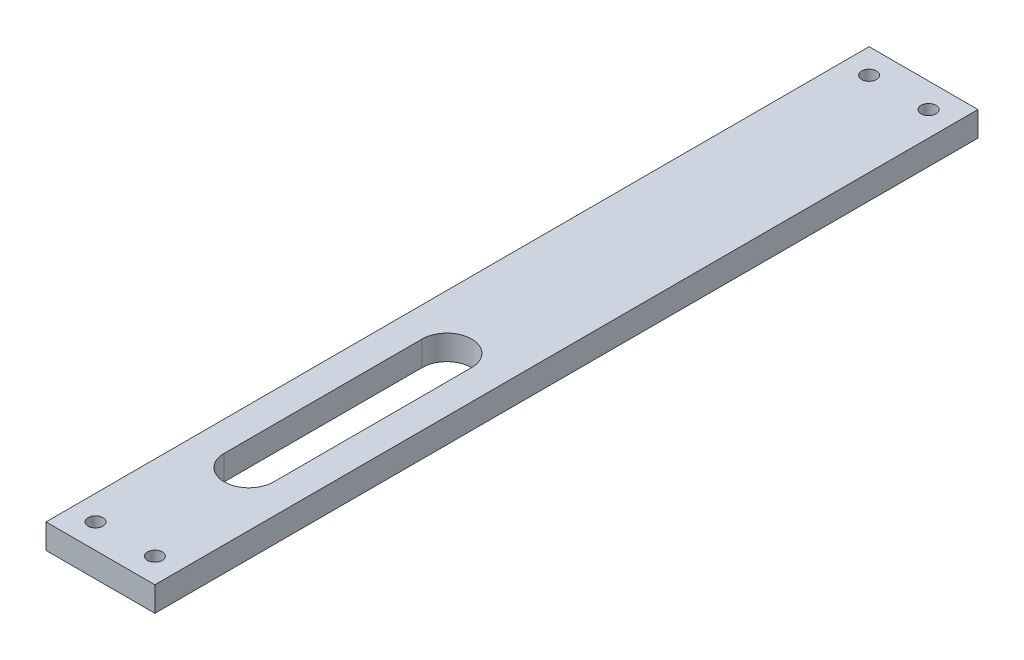
ISO-10303-21;
HEADER;
FILE_DESCRIPTION(('STEP AP214'),'2;1');
FILE_NAME('part.step','',(''),(''),'','','');
FILE_SCHEMA(('AUTOMOTIVE_DESIGN { 1 0 10303 214 1 1 1 1 }'));
ENDSEC;
DATA;
#1=APPLICATION_CONTEXT('core data for automotive mechanical design processes');
#2=APPLICATION_PROTOCOL_DEFINITION('international standard','automotive_design',2000,#1);
#3=PRODUCT_CONTEXT('',#1,'mechanical');
#4=PRODUCT('Part','Part','',(#3));
#5=PRODUCT_RELATED_PRODUCT_CATEGORY('part','',(#4));
#6=PRODUCT_DEFINITION_FORMATION('','',#4);
#7=PRODUCT_DEFINITION_CONTEXT('part definition',#1,'design');
#8=PRODUCT_DEFINITION('design','',#6,#7);
#9=PRODUCT_DEFINITION_SHAPE('','',#8);
#10=(LENGTH_UNIT() NAMED_UNIT(*) SI_UNIT(.MILLI.,.METRE.));
#11=(NAMED_UNIT(*) PLANE_ANGLE_UNIT() SI_UNIT($,.RADIAN.));
#12=(NAMED_UNIT(*) SI_UNIT($,.STERADIAN.) SOLID_ANGLE_UNIT());
#13=UNCERTAINTY_MEASURE_WITH_UNIT(LENGTH_MEASURE(1.E-05),#10,'distance_accuracy_value','');
#14=(GEOMETRIC_REPRESENTATION_CONTEXT(3) GLOBAL_UNCERTAINTY_ASSIGNED_CONTEXT((#13)) GLOBAL_UNIT_ASSIGNED_CONTEXT((#10,
#11,#12)) REPRESENTATION_CONTEXT('',''));
#15=CARTESIAN_POINT('',(0.,0.,0.));
#16=DIRECTION('',(0.,0.,1.));
#17=DIRECTION('',(1.,0.,0.));
#18=AXIS2_PLACEMENT_3D('',#15,#16,#17);
#19=CARTESIAN_POINT('',(22.,5.,0.));
#20=DIRECTION('',(-1.,0.,0.));
#21=DIRECTION('',(0.,0.,1.));
#22=AXIS2_PLACEMENT_3D('',#19,#20,#21);
#23=PLANE('',#22);
#24=DIRECTION('',(0.,0.,-1.));
#25=VECTOR('',#24,1.);
#26=CARTESIAN_POINT('',(22.,0.,0.));
#27=LINE('',#26,#25);
#28=CARTESIAN_POINT('',(22.,0.,0.));
#29=VERTEX_POINT('',#28);
#30=CARTESIAN_POINT('',(22.,0.,-166.3));
#31=VERTEX_POINT('',#30);
#32=EDGE_CURVE('E163',#29,#31,#27,.T.);
#33=ORIENTED_EDGE('',*,*,#32,.T.);
#34=DIRECTION('',(0.,-1.,0.));
#35=VECTOR('',#34,1.);
#36=CARTESIAN_POINT('',(22.,5.,-166.3));
#37=LINE('',#36,#35);
#38=CARTESIAN_POINT('',(22.,5.,-166.3));
#39=VERTEX_POINT('',#38);
#40=EDGE_CURVE('E11',#39,#31,#37,.T.);
#41=ORIENTED_EDGE('',*,*,#40,.F.);
#42=DIRECTION('',(0.,0.,-1.));
#43=VECTOR('',#42,1.);
#44=CARTESIAN_POINT('',(22.,5.,0.));
#45=LINE('',#44,#43);
#46=CARTESIAN_POINT('',(22.,5.,0.));
#47=VERTEX_POINT('',#46);
#48=EDGE_CURVE('E141',#47,#39,#45,.T.);
#49=ORIENTED_EDGE('',*,*,#48,.F.);
#50=DIRECTION('',(0.,-1.,0.));
#51=VECTOR('',#50,1.);
#52=CARTESIAN_POINT('',(22.,5.,0.));
#53=LINE('',#52,#51);
#54=EDGE_CURVE('E157',#47,#29,#53,.T.);
#55=ORIENTED_EDGE('',*,*,#54,.T.);
#56=EDGE_LOOP('',(#33,#41,#49,#55));
#57=FACE_BOUND('',#56,.T.);
#58=ADVANCED_FACE('F34',(#57),#23,.F.);
#59=CARTESIAN_POINT('',(0.,5.,-166.3));
#60=DIRECTION('',(0.,0.,-1.));
#61=DIRECTION('',(-1.,0.,0.));
#62=AXIS2_PLACEMENT_3D('',#59,#60,#61);
#63=PLANE('',#62);
#64=DIRECTION('',(1.,0.,0.));
#65=VECTOR('',#64,1.);
#66=CARTESIAN_POINT('',(0.,0.,-166.3));
#67=LINE('',#66,#65);
#68=CARTESIAN_POINT('',(0.,0.,-166.3));
#69=VERTEX_POINT('',#68);
#70=EDGE_CURVE('E166',#69,#31,#67,.T.);
#71=ORIENTED_EDGE('',*,*,#70,.F.);
#72=DIRECTION('',(0.,-1.,0.));
#73=VECTOR('',#72,1.);
#74=CARTESIAN_POINT('',(0.,5.,-166.3));
#75=LINE('',#74,#73);
#76=CARTESIAN_POINT('',(0.,5.,-166.3));
#77=VERTEX_POINT('',#76);
#78=EDGE_CURVE('E42',#77,#69,#75,.T.);
#79=ORIENTED_EDGE('',*,*,#78,.F.);
#80=DIRECTION('',(1.,0.,0.));
#81=VECTOR('',#80,1.);
#82=CARTESIAN_POINT('',(0.,5.,-166.3));
#83=LINE('',#82,#81);
#84=EDGE_CURVE('E143',#77,#39,#83,.T.);
#85=ORIENTED_EDGE('',*,*,#84,.T.);
#86=ORIENTED_EDGE('',*,*,#40,.T.);
#87=EDGE_LOOP('',(#71,#79,#85,#86));
#88=FACE_BOUND('',#87,.T.);
#89=ADVANCED_FACE('F189',(#88),#63,.T.);
#90=CARTESIAN_POINT('',(0.,5.,0.));
#91=DIRECTION('',(-1.,0.,0.));
#92=DIRECTION('',(0.,0.,1.));
#93=AXIS2_PLACEMENT_3D('',#90,#91,#92);
#94=PLANE('',#93);
#95=DIRECTION('',(0.,0.,-1.));
#96=VECTOR('',#95,1.);
#97=CARTESIAN_POINT('',(0.,0.,0.));
#98=LINE('',#97,#96);
#99=CARTESIAN_POINT('',(0.,0.,0.));
#100=VERTEX_POINT('',#99);
#101=EDGE_CURVE('E169',#100,#69,#98,.T.);
#102=ORIENTED_EDGE('',*,*,#101,.F.);
#103=DIRECTION('',(0.,-1.,0.));
#104=VECTOR('',#103,1.);
#105=CARTESIAN_POINT('',(0.,5.,0.));
#106=LINE('',#105,#104);
#107=CARTESIAN_POINT('',(0.,5.,0.));
#108=VERTEX_POINT('',#107);
#109=EDGE_CURVE('E181',#108,#100,#106,.T.);
#110=ORIENTED_EDGE('',*,*,#109,.F.);
#111=DIRECTION('',(0.,0.,-1.));
#112=VECTOR('',#111,1.);
#113=CARTESIAN_POINT('',(0.,5.,0.));
#114=LINE('',#113,#112);
#115=EDGE_CURVE('E146',#108,#77,#114,.T.);
#116=ORIENTED_EDGE('',*,*,#115,.T.);
#117=ORIENTED_EDGE('',*,*,#78,.T.);
#118=EDGE_LOOP('',(#102,#110,#116,#117));
#119=FACE_BOUND('',#118,.T.);
#120=ADVANCED_FACE('F185',(#119),#94,.T.);
#121=CARTESIAN_POINT('',(17.,5.,-5.));
#122=DIRECTION('',(0.,-1.,0.));
#123=DIRECTION('',(0.,0.,-1.));
#124=AXIS2_PLACEMENT_3D('',#121,#122,#123);
#125=CYLINDRICAL_SURFACE('',#124,1.5);
#126=CARTESIAN_POINT('',(17.,5.,-5.));
#127=DIRECTION('',(0.,1.,0.));
#128=DIRECTION('',(0.,0.,1.));
#129=AXIS2_PLACEMENT_3D('',#126,#127,#128);
#130=CIRCLE('',#129,1.5);
#131=CARTESIAN_POINT('',(17.,5.,-3.5));
#132=VERTEX_POINT('',#131);
#133=EDGE_CURVE('E151',#132,#132,#130,.F.);
#134=ORIENTED_EDGE('',*,*,#133,.F.);
#135=EDGE_LOOP('',(#134));
#136=FACE_BOUND('',#135,.T.);
#137=CARTESIAN_POINT('',(17.,0.,-5.));
#138=DIRECTION('',(0.,1.,0.));
#139=DIRECTION('',(0.,0.,1.));
#140=AXIS2_PLACEMENT_3D('',#137,#138,#139);
#141=CIRCLE('',#140,1.5);
#142=CARTESIAN_POINT('',(17.,0.,-3.5));
#143=VERTEX_POINT('',#142);
#144=EDGE_CURVE('E174',#143,#143,#141,.F.);
#145=ORIENTED_EDGE('',*,*,#144,.T.);
#146=EDGE_LOOP('',(#145));
#147=FACE_BOUND('',#146,.T.);
#148=ADVANCED_FACE('F241',(#136,#147),#125,.F.);
#149=CARTESIAN_POINT('',(0.,5.,0.));
#150=DIRECTION('',(0.,0.,-1.));
#151=DIRECTION('',(-1.,0.,0.));
#152=AXIS2_PLACEMENT_3D('',#149,#150,#151);
#153=PLANE('',#152);
#154=DIRECTION('',(1.,0.,0.));
#155=VECTOR('',#154,1.);
#156=CARTESIAN_POINT('',(0.,0.,0.));
#157=LINE('',#156,#155);
#158=EDGE_CURVE('E172',#100,#29,#157,.T.);
#159=ORIENTED_EDGE('',*,*,#158,.T.);
#160=ORIENTED_EDGE('',*,*,#54,.F.);
#161=DIRECTION('',(1.,0.,0.));
#162=VECTOR('',#161,1.);
#163=CARTESIAN_POINT('',(0.,5.,0.));
#164=LINE('',#163,#162);
#165=EDGE_CURVE('E149',#108,#47,#164,.T.);
#166=ORIENTED_EDGE('',*,*,#165,.F.);
#167=ORIENTED_EDGE('',*,*,#109,.T.);
#168=EDGE_LOOP('',(#159,#160,#166,#167));
#169=FACE_BOUND('',#168,.T.);
#170=ADVANCED_FACE('F198',(#169),#153,.F.);
#171=CARTESIAN_POINT('',(5.,5.,-161.3));
#172=DIRECTION('',(0.,-1.,0.));
#173=DIRECTION('',(0.,0.,-1.));
#174=AXIS2_PLACEMENT_3D('',#171,#172,#173);
#175=CYLINDRICAL_SURFACE('',#174,1.5);
#176=CARTESIAN_POINT('',(5.,5.,-161.3));
#177=DIRECTION('',(0.,1.,0.));
#178=DIRECTION('',(0.,0.,1.));
#179=AXIS2_PLACEMENT_3D('',#176,#177,#178);
#180=CIRCLE('',#179,1.5);
#181=CARTESIAN_POINT('',(5.,5.,-159.8));
#182=VERTEX_POINT('',#181);
#183=EDGE_CURVE('E137',#182,#182,#180,.T.);
#184=ORIENTED_EDGE('',*,*,#183,.T.);
#185=EDGE_LOOP('',(#184));
#186=FACE_BOUND('',#185,.T.);
#187=CARTESIAN_POINT('',(5.,0.,-161.3));
#188=DIRECTION('',(0.,1.,0.));
#189=DIRECTION('',(0.,0.,1.));
#190=AXIS2_PLACEMENT_3D('',#187,#188,#189);
#191=CIRCLE('',#190,1.5);
#192=CARTESIAN_POINT('',(5.,0.,-159.8));
#193=VERTEX_POINT('',#192);
#194=EDGE_CURVE('E160',#193,#193,#191,.T.);
#195=ORIENTED_EDGE('',*,*,#194,.F.);
#196=EDGE_LOOP('',(#195));
#197=FACE_BOUND('',#196,.T.);
#198=ADVANCED_FACE('F233',(#186,#197),#175,.F.);
#199=CARTESIAN_POINT('',(17.,5.,-161.3));
#200=DIRECTION('',(0.,-1.,0.));
#201=DIRECTION('',(0.,0.,-1.));
#202=AXIS2_PLACEMENT_3D('',#199,#200,#201);
#203=CYLINDRICAL_SURFACE('',#202,1.5);
#204=CARTESIAN_POINT('',(17.,5.,-161.3));
#205=DIRECTION('',(0.,1.,0.));
#206=DIRECTION('',(0.,0.,1.));
#207=AXIS2_PLACEMENT_3D('',#204,#205,#206);
#208=CIRCLE('',#207,1.5);
#209=CARTESIAN_POINT('',(17.,5.,-159.8));
#210=VERTEX_POINT('',#209);
#211=EDGE_CURVE('E134',#210,#210,#208,.T.);
#212=ORIENTED_EDGE('',*,*,#211,.T.);
#213=EDGE_LOOP('',(#212));
#214=FACE_BOUND('',#213,.T.);
#215=CARTESIAN_POINT('',(17.,0.,-161.3));
#216=DIRECTION('',(0.,1.,0.));
#217=DIRECTION('',(0.,0.,1.));
#218=AXIS2_PLACEMENT_3D('',#215,#216,#217);
#219=CIRCLE('',#218,1.5);
#220=CARTESIAN_POINT('',(17.,0.,-159.8));
#221=VERTEX_POINT('',#220);
#222=EDGE_CURVE('E130',#221,#221,#219,.T.);
#223=ORIENTED_EDGE('',*,*,#222,.F.);
#224=EDGE_LOOP('',(#223));
#225=FACE_BOUND('',#224,.T.);
#226=ADVANCED_FACE('F36',(#214,#225),#203,.F.);
#227=CARTESIAN_POINT('',(5.,5.,-5.));
#228=DIRECTION('',(0.,-1.,0.));
#229=DIRECTION('',(0.,0.,-1.));
#230=AXIS2_PLACEMENT_3D('',#227,#228,#229);
#231=CYLINDRICAL_SURFACE('',#230,1.5);
#232=CARTESIAN_POINT('',(5.,5.,-5.));
#233=DIRECTION('',(0.,1.,0.));
#234=DIRECTION('',(0.,0.,1.));
#235=AXIS2_PLACEMENT_3D('',#232,#233,#234);
#236=CIRCLE('',#235,1.5);
#237=CARTESIAN_POINT('',(5.,5.,-3.5));
#238=VERTEX_POINT('',#237);
#239=EDGE_CURVE('E154',#238,#238,#236,.F.);
#240=ORIENTED_EDGE('',*,*,#239,.F.);
#241=EDGE_LOOP('',(#240));
#242=FACE_BOUND('',#241,.T.);
#243=CARTESIAN_POINT('',(5.,0.,-5.));
#244=DIRECTION('',(0.,1.,0.));
#245=DIRECTION('',(0.,0.,1.));
#246=AXIS2_PLACEMENT_3D('',#243,#244,#245);
#247=CIRCLE('',#246,1.5);
#248=CARTESIAN_POINT('',(5.,0.,-3.5));
#249=VERTEX_POINT('',#248);
#250=EDGE_CURVE('E138',#249,#249,#247,.F.);
#251=ORIENTED_EDGE('',*,*,#250,.T.);
#252=EDGE_LOOP('',(#251));
#253=FACE_BOUND('',#252,.T.);
#254=ADVANCED_FACE('F205',(#242,#253),#231,.F.);
#255=CARTESIAN_POINT('',(0.,5.,0.));
#256=DIRECTION('',(0.,1.,0.));
#257=DIRECTION('',(0.,0.,1.));
#258=AXIS2_PLACEMENT_3D('',#255,#256,#257);
#259=PLANE('',#258);
#260=DIRECTION('',(0.,0.,-1.));
#261=VECTOR('',#260,1.);
#262=CARTESIAN_POINT('',(6.,5.,0.));
#263=LINE('',#262,#261);
#264=CARTESIAN_POINT('',(6.,5.,-30.));
#265=VERTEX_POINT('',#264);
#266=CARTESIAN_POINT('',(6.,5.,-70.));
#267=VERTEX_POINT('',#266);
#268=EDGE_CURVE('E100',#265,#267,#263,.T.);
#269=ORIENTED_EDGE('',*,*,#268,.T.);
#270=CARTESIAN_POINT('',(11.,5.,-70.));
#271=DIRECTION('',(0.,-1.,0.));
#272=DIRECTION('',(0.,0.,-1.));
#273=AXIS2_PLACEMENT_3D('',#270,#271,#272);
#274=CIRCLE('',#273,5.);
#275=CARTESIAN_POINT('',(16.,5.,-70.));
#276=VERTEX_POINT('',#275);
#277=EDGE_CURVE('E106',#267,#276,#274,.T.);
#278=ORIENTED_EDGE('',*,*,#277,.T.);
#279=DIRECTION('',(0.,0.,-1.));
#280=VECTOR('',#279,1.);
#281=CARTESIAN_POINT('',(16.,5.,0.));
#282=LINE('',#281,#280);
#283=CARTESIAN_POINT('',(16.,5.,-30.));
#284=VERTEX_POINT('',#283);
#285=EDGE_CURVE('E110',#284,#276,#282,.T.);
#286=ORIENTED_EDGE('',*,*,#285,.F.);
#287=CARTESIAN_POINT('',(11.,5.,-30.));
#288=DIRECTION('',(0.,-1.,0.));
#289=DIRECTION('',(0.,0.,-1.));
#290=AXIS2_PLACEMENT_3D('',#287,#288,#289);
#291=CIRCLE('',#290,5.);
#292=EDGE_CURVE('E103',#284,#265,#291,.T.);
#293=ORIENTED_EDGE('',*,*,#292,.T.);
#294=EDGE_LOOP('',(#269,#278,#286,#293));
#295=FACE_BOUND('',#294,.T.);
#296=ORIENTED_EDGE('',*,*,#211,.F.);
#297=EDGE_LOOP('',(#296));
#298=FACE_BOUND('',#297,.T.);
#299=ORIENTED_EDGE('',*,*,#183,.F.);
#300=EDGE_LOOP('',(#299));
#301=FACE_BOUND('',#300,.T.);
#302=ORIENTED_EDGE('',*,*,#48,.T.);
#303=ORIENTED_EDGE('',*,*,#84,.F.);
#304=ORIENTED_EDGE('',*,*,#115,.F.);
#305=ORIENTED_EDGE('',*,*,#165,.T.);
#306=EDGE_LOOP('',(#302,#303,#304,#305));
#307=FACE_BOUND('',#306,.T.);
#308=ORIENTED_EDGE('',*,*,#133,.T.);
#309=EDGE_LOOP('',(#308));
#310=FACE_BOUND('',#309,.T.);
#311=ORIENTED_EDGE('',*,*,#239,.T.);
#312=EDGE_LOOP('',(#311));
#313=FACE_BOUND('',#312,.T.);
#314=ADVANCED_FACE('F112',(#295,#298,#301,#307,#310,#313),#259,.T.);
#315=CARTESIAN_POINT('',(0.,0.,0.));
#316=DIRECTION('',(0.,1.,0.));
#317=DIRECTION('',(0.,0.,1.));
#318=AXIS2_PLACEMENT_3D('',#315,#316,#317);
#319=PLANE('',#318);
#320=CARTESIAN_POINT('',(11.,0.,-70.));
#321=DIRECTION('',(0.,-1.,0.));
#322=DIRECTION('',(0.,0.,-1.));
#323=AXIS2_PLACEMENT_3D('',#320,#321,#322);
#324=CIRCLE('',#323,5.);
#325=CARTESIAN_POINT('',(6.,0.,-70.));
#326=VERTEX_POINT('',#325);
#327=CARTESIAN_POINT('',(16.,0.,-70.));
#328=VERTEX_POINT('',#327);
#329=EDGE_CURVE('E124',#326,#328,#324,.T.);
#330=ORIENTED_EDGE('',*,*,#329,.F.);
#331=DIRECTION('',(0.,0.,-1.));
#332=VECTOR('',#331,1.);
#333=CARTESIAN_POINT('',(6.,0.,0.));
#334=LINE('',#333,#332);
#335=CARTESIAN_POINT('',(6.,0.,-30.));
#336=VERTEX_POINT('',#335);
#337=EDGE_CURVE('E57',#336,#326,#334,.T.);
#338=ORIENTED_EDGE('',*,*,#337,.F.);
#339=CARTESIAN_POINT('',(11.,0.,-30.));
#340=DIRECTION('',(0.,-1.,0.));
#341=DIRECTION('',(0.,0.,-1.));
#342=AXIS2_PLACEMENT_3D('',#339,#340,#341);
#343=CIRCLE('',#342,5.);
#344=CARTESIAN_POINT('',(16.,0.,-30.));
#345=VERTEX_POINT('',#344);
#346=EDGE_CURVE('E115',#345,#336,#343,.T.);
#347=ORIENTED_EDGE('',*,*,#346,.F.);
#348=DIRECTION('',(0.,0.,-1.));
#349=VECTOR('',#348,1.);
#350=CARTESIAN_POINT('',(16.,0.,0.));
#351=LINE('',#350,#349);
#352=EDGE_CURVE('E118',#345,#328,#351,.T.);
#353=ORIENTED_EDGE('',*,*,#352,.T.);
#354=EDGE_LOOP('',(#330,#338,#347,#353));
#355=FACE_BOUND('',#354,.T.);
#356=ORIENTED_EDGE('',*,*,#222,.T.);
#357=EDGE_LOOP('',(#356));
#358=FACE_BOUND('',#357,.T.);
#359=ORIENTED_EDGE('',*,*,#194,.T.);
#360=EDGE_LOOP('',(#359));
#361=FACE_BOUND('',#360,.T.);
#362=ORIENTED_EDGE('',*,*,#32,.F.);
#363=ORIENTED_EDGE('',*,*,#158,.F.);
#364=ORIENTED_EDGE('',*,*,#101,.T.);
#365=ORIENTED_EDGE('',*,*,#70,.T.);
#366=EDGE_LOOP('',(#362,#363,#364,#365));
#367=FACE_BOUND('',#366,.T.);
#368=ORIENTED_EDGE('',*,*,#144,.F.);
#369=EDGE_LOOP('',(#368));
#370=FACE_BOUND('',#369,.T.);
#371=ORIENTED_EDGE('',*,*,#250,.F.);
#372=EDGE_LOOP('',(#371));
#373=FACE_BOUND('',#372,.T.);
#374=ADVANCED_FACE('F194',(#355,#358,#361,#367,#370,#373),#319,.F.);
#375=CARTESIAN_POINT('',(6.,5.,0.));
#376=DIRECTION('',(-1.,0.,0.));
#377=DIRECTION('',(0.,0.,1.));
#378=AXIS2_PLACEMENT_3D('',#375,#376,#377);
#379=PLANE('',#378);
#380=ORIENTED_EDGE('',*,*,#337,.T.);
#381=DIRECTION('',(0.,-1.,0.));
#382=VECTOR('',#381,1.);
#383=CARTESIAN_POINT('',(6.,5.,-70.));
#384=LINE('',#383,#382);
#385=EDGE_CURVE('E97',#267,#326,#384,.T.);
#386=ORIENTED_EDGE('',*,*,#385,.F.);
#387=ORIENTED_EDGE('',*,*,#268,.F.);
#388=DIRECTION('',(0.,-1.,0.));
#389=VECTOR('',#388,1.);
#390=CARTESIAN_POINT('',(6.,5.,-30.));
#391=LINE('',#390,#389);
#392=EDGE_CURVE('E128',#265,#336,#391,.T.);
#393=ORIENTED_EDGE('',*,*,#392,.T.);
#394=EDGE_LOOP('',(#380,#386,#387,#393));
#395=FACE_BOUND('',#394,.T.);
#396=ADVANCED_FACE('F98',(#395),#379,.F.);
#397=CARTESIAN_POINT('',(11.,5.,-30.));
#398=DIRECTION('',(0.,-1.,0.));
#399=DIRECTION('',(0.,0.,-1.));
#400=AXIS2_PLACEMENT_3D('',#397,#398,#399);
#401=CYLINDRICAL_SURFACE('',#400,5.);
#402=ORIENTED_EDGE('',*,*,#346,.T.);
#403=ORIENTED_EDGE('',*,*,#392,.F.);
#404=ORIENTED_EDGE('',*,*,#292,.F.);
#405=DIRECTION('',(0.,-1.,0.));
#406=VECTOR('',#405,1.);
#407=CARTESIAN_POINT('',(16.,5.,-30.));
#408=LINE('',#407,#406);
#409=EDGE_CURVE('E131',#284,#345,#408,.T.);
#410=ORIENTED_EDGE('',*,*,#409,.T.);
#411=EDGE_LOOP('',(#402,#403,#404,#410));
#412=FACE_BOUND('',#411,.T.);
#413=ADVANCED_FACE('F223',(#412),#401,.F.);
#414=CARTESIAN_POINT('',(16.,5.,0.));
#415=DIRECTION('',(-1.,0.,0.));
#416=DIRECTION('',(0.,0.,1.));
#417=AXIS2_PLACEMENT_3D('',#414,#415,#416);
#418=PLANE('',#417);
#419=ORIENTED_EDGE('',*,*,#352,.F.);
#420=ORIENTED_EDGE('',*,*,#409,.F.);
#421=ORIENTED_EDGE('',*,*,#285,.T.);
#422=DIRECTION('',(0.,-1.,0.));
#423=VECTOR('',#422,1.);
#424=CARTESIAN_POINT('',(16.,5.,-70.));
#425=LINE('',#424,#423);
#426=EDGE_CURVE('E49',#276,#328,#425,.T.);
#427=ORIENTED_EDGE('',*,*,#426,.T.);
#428=EDGE_LOOP('',(#419,#420,#421,#427));
#429=FACE_BOUND('',#428,.T.);
#430=ADVANCED_FACE('F305',(#429),#418,.T.);
#431=CARTESIAN_POINT('',(11.,5.,-70.));
#432=DIRECTION('',(0.,-1.,0.));
#433=DIRECTION('',(0.,0.,-1.));
#434=AXIS2_PLACEMENT_3D('',#431,#432,#433);
#435=CYLINDRICAL_SURFACE('',#434,5.);
#436=ORIENTED_EDGE('',*,*,#329,.T.);
#437=ORIENTED_EDGE('',*,*,#426,.F.);
#438=ORIENTED_EDGE('',*,*,#277,.F.);
#439=ORIENTED_EDGE('',*,*,#385,.T.);
#440=EDGE_LOOP('',(#436,#437,#438,#439));
#441=FACE_BOUND('',#440,.T.);
#442=ADVANCED_FACE('F107',(#441),#435,.F.);
#443=CLOSED_SHELL('',(#58,#89,#120,#148,#170,#198,#226,#254,#314,#374,#396,#413,#430,#442));
#444=MANIFOLD_SOLID_BREP('B2',#443);
#445=ADVANCED_BREP_SHAPE_REPRESENTATION('',(#18,#444),#14);
#446=SHAPE_DEFINITION_REPRESENTATION(#9,#445);
ENDSEC;
END-ISO-10303-21;
